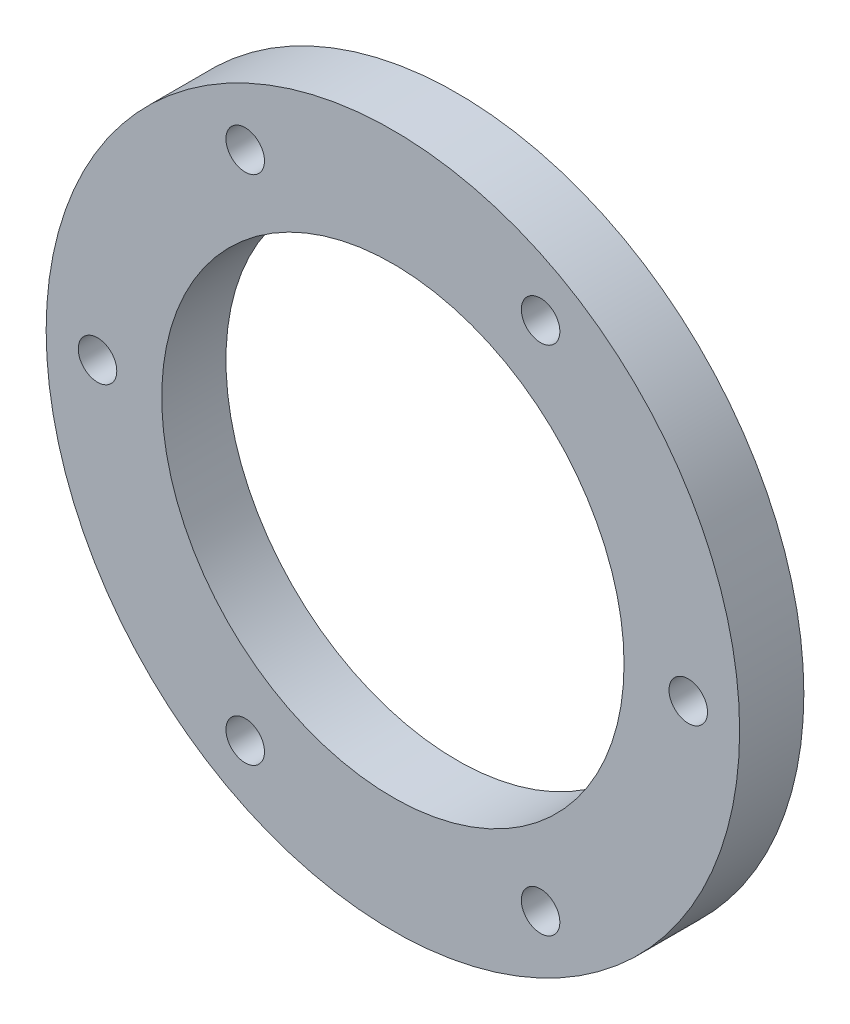
ISO-10303-21;
HEADER;
FILE_DESCRIPTION(('STEP AP214'),'2;1');
FILE_NAME('part.step','',(''),(''),'','','');
FILE_SCHEMA(('AUTOMOTIVE_DESIGN { 1 0 10303 214 1 1 1 1 }'));
ENDSEC;
DATA;
#1=APPLICATION_CONTEXT('core data for automotive mechanical design processes');
#2=APPLICATION_PROTOCOL_DEFINITION('international standard','automotive_design',2000,#1);
#3=PRODUCT_CONTEXT('',#1,'mechanical');
#4=PRODUCT('Part','Part','',(#3));
#5=PRODUCT_RELATED_PRODUCT_CATEGORY('part','',(#4));
#6=PRODUCT_DEFINITION_FORMATION('','',#4);
#7=PRODUCT_DEFINITION_CONTEXT('part definition',#1,'design');
#8=PRODUCT_DEFINITION('design','',#6,#7);
#9=PRODUCT_DEFINITION_SHAPE('','',#8);
#10=(LENGTH_UNIT() NAMED_UNIT(*) SI_UNIT(.MILLI.,.METRE.));
#11=(NAMED_UNIT(*) PLANE_ANGLE_UNIT() SI_UNIT($,.RADIAN.));
#12=(NAMED_UNIT(*) SI_UNIT($,.STERADIAN.) SOLID_ANGLE_UNIT());
#13=UNCERTAINTY_MEASURE_WITH_UNIT(LENGTH_MEASURE(1.E-05),#10,'distance_accuracy_value','');
#14=(GEOMETRIC_REPRESENTATION_CONTEXT(3) GLOBAL_UNCERTAINTY_ASSIGNED_CONTEXT((#13)) GLOBAL_UNIT_ASSIGNED_CONTEXT((#10,
#11,#12)) REPRESENTATION_CONTEXT('',''));
#15=CARTESIAN_POINT('',(0.,0.,0.));
#16=DIRECTION('',(0.,0.,1.));
#17=DIRECTION('',(1.,0.,0.));
#18=AXIS2_PLACEMENT_3D('',#15,#16,#17);
#19=CARTESIAN_POINT('',(0.,0.,5.));
#20=DIRECTION('',(0.,0.,1.));
#21=DIRECTION('',(1.,0.,0.));
#22=AXIS2_PLACEMENT_3D('',#19,#20,#21);
#23=PLANE('',#22);
#24=CARTESIAN_POINT('',(23.,0.,5.));
#25=DIRECTION('',(0.,0.,1.));
#26=DIRECTION('',(1.,0.,0.));
#27=AXIS2_PLACEMENT_3D('',#24,#25,#26);
#28=CIRCLE('',#27,1.5);
#29=CARTESIAN_POINT('',(24.5,0.,5.));
#30=VERTEX_POINT('',#29);
#31=EDGE_CURVE('E71',#30,#30,#28,.T.);
#32=ORIENTED_EDGE('',*,*,#31,.F.);
#33=EDGE_LOOP('',(#32));
#34=FACE_BOUND('',#33,.T.);
#35=CARTESIAN_POINT('',(-11.4999999999999,-19.9185842870421,5.));
#36=DIRECTION('',(0.,0.,1.));
#37=DIRECTION('',(1.,0.,0.));
#38=AXIS2_PLACEMENT_3D('',#35,#36,#37);
#39=CIRCLE('',#38,1.5);
#40=CARTESIAN_POINT('',(-9.99999999999994,-19.9185842870421,5.));
#41=VERTEX_POINT('',#40);
#42=EDGE_CURVE('E59',#41,#41,#39,.T.);
#43=ORIENTED_EDGE('',*,*,#42,.F.);
#44=EDGE_LOOP('',(#43));
#45=FACE_BOUND('',#44,.T.);
#46=CARTESIAN_POINT('',(-11.5000000000001,19.918584287042,5.));
#47=DIRECTION('',(0.,0.,1.));
#48=DIRECTION('',(1.,0.,0.));
#49=AXIS2_PLACEMENT_3D('',#46,#47,#48);
#50=CIRCLE('',#49,1.50000000000001);
#51=CARTESIAN_POINT('',(-10.0000000000001,19.918584287042,5.));
#52=VERTEX_POINT('',#51);
#53=EDGE_CURVE('E47',#52,#52,#50,.T.);
#54=ORIENTED_EDGE('',*,*,#53,.F.);
#55=EDGE_LOOP('',(#54));
#56=FACE_BOUND('',#55,.T.);
#57=CARTESIAN_POINT('',(0.,0.,5.));
#58=DIRECTION('',(0.,0.,1.));
#59=DIRECTION('',(1.,0.,0.));
#60=AXIS2_PLACEMENT_3D('',#57,#58,#59);
#61=CIRCLE('',#60,27.);
#62=CARTESIAN_POINT('',(27.,0.,5.));
#63=VERTEX_POINT('',#62);
#64=EDGE_CURVE('E10',#63,#63,#61,.T.);
#65=ORIENTED_EDGE('',*,*,#64,.T.);
#66=EDGE_LOOP('',(#65));
#67=FACE_BOUND('',#66,.T.);
#68=CARTESIAN_POINT('',(0.,0.,5.));
#69=DIRECTION('',(0.,0.,1.));
#70=DIRECTION('',(1.,0.,0.));
#71=AXIS2_PLACEMENT_3D('',#68,#69,#70);
#72=CIRCLE('',#71,18.);
#73=CARTESIAN_POINT('',(18.,0.,5.));
#74=VERTEX_POINT('',#73);
#75=EDGE_CURVE('E42',#74,#74,#72,.T.);
#76=ORIENTED_EDGE('',*,*,#75,.F.);
#77=EDGE_LOOP('',(#76));
#78=FACE_BOUND('',#77,.T.);
#79=CARTESIAN_POINT('',(-23.,0.,5.));
#80=DIRECTION('',(0.,0.,1.));
#81=DIRECTION('',(1.,0.,0.));
#82=AXIS2_PLACEMENT_3D('',#79,#80,#81);
#83=CIRCLE('',#82,1.5);
#84=CARTESIAN_POINT('',(-21.5,0.,5.));
#85=VERTEX_POINT('',#84);
#86=EDGE_CURVE('E53',#85,#85,#83,.T.);
#87=ORIENTED_EDGE('',*,*,#86,.F.);
#88=EDGE_LOOP('',(#87));
#89=FACE_BOUND('',#88,.T.);
#90=CARTESIAN_POINT('',(11.5000000000001,-19.918584287042,5.));
#91=DIRECTION('',(0.,0.,1.));
#92=DIRECTION('',(1.,0.,0.));
#93=AXIS2_PLACEMENT_3D('',#90,#91,#92);
#94=CIRCLE('',#93,1.5);
#95=CARTESIAN_POINT('',(13.0000000000001,-19.918584287042,5.));
#96=VERTEX_POINT('',#95);
#97=EDGE_CURVE('E65',#96,#96,#94,.T.);
#98=ORIENTED_EDGE('',*,*,#97,.F.);
#99=EDGE_LOOP('',(#98));
#100=FACE_BOUND('',#99,.T.);
#101=CARTESIAN_POINT('',(11.5,19.9185842870421,5.));
#102=DIRECTION('',(0.,0.,1.));
#103=DIRECTION('',(1.,0.,0.));
#104=AXIS2_PLACEMENT_3D('',#101,#102,#103);
#105=CIRCLE('',#104,1.5);
#106=CARTESIAN_POINT('',(12.9999999999999,19.9185842870421,5.));
#107=VERTEX_POINT('',#106);
#108=EDGE_CURVE('E77',#107,#107,#105,.T.);
#109=ORIENTED_EDGE('',*,*,#108,.F.);
#110=EDGE_LOOP('',(#109));
#111=FACE_BOUND('',#110,.T.);
#112=ADVANCED_FACE('F31',(#34,#45,#56,#67,#78,#89,#100,#111),#23,.T.);
#113=CARTESIAN_POINT('',(0.,0.,0.));
#114=DIRECTION('',(0.,0.,1.));
#115=DIRECTION('',(1.,0.,0.));
#116=AXIS2_PLACEMENT_3D('',#113,#114,#115);
#117=PLANE('',#116);
#118=CARTESIAN_POINT('',(0.,0.,0.));
#119=DIRECTION('',(0.,0.,1.));
#120=DIRECTION('',(1.,0.,0.));
#121=AXIS2_PLACEMENT_3D('',#118,#119,#120);
#122=CIRCLE('',#121,27.);
#123=CARTESIAN_POINT('',(27.,0.,0.));
#124=VERTEX_POINT('',#123);
#125=EDGE_CURVE('E35',#124,#124,#122,.T.);
#126=ORIENTED_EDGE('',*,*,#125,.F.);
#127=EDGE_LOOP('',(#126));
#128=FACE_BOUND('',#127,.T.);
#129=CARTESIAN_POINT('',(0.,0.,0.));
#130=DIRECTION('',(0.,0.,1.));
#131=DIRECTION('',(1.,0.,0.));
#132=AXIS2_PLACEMENT_3D('',#129,#130,#131);
#133=CIRCLE('',#132,18.);
#134=CARTESIAN_POINT('',(18.,0.,0.));
#135=VERTEX_POINT('',#134);
#136=EDGE_CURVE('E44',#135,#135,#133,.T.);
#137=ORIENTED_EDGE('',*,*,#136,.T.);
#138=EDGE_LOOP('',(#137));
#139=FACE_BOUND('',#138,.T.);
#140=CARTESIAN_POINT('',(-11.5000000000001,19.918584287042,0.));
#141=DIRECTION('',(0.,0.,1.));
#142=DIRECTION('',(1.,0.,0.));
#143=AXIS2_PLACEMENT_3D('',#140,#141,#142);
#144=CIRCLE('',#143,1.50000000000001);
#145=CARTESIAN_POINT('',(-10.0000000000001,19.918584287042,0.));
#146=VERTEX_POINT('',#145);
#147=EDGE_CURVE('E50',#146,#146,#144,.T.);
#148=ORIENTED_EDGE('',*,*,#147,.T.);
#149=EDGE_LOOP('',(#148));
#150=FACE_BOUND('',#149,.T.);
#151=CARTESIAN_POINT('',(-23.,0.,0.));
#152=DIRECTION('',(0.,0.,1.));
#153=DIRECTION('',(1.,0.,0.));
#154=AXIS2_PLACEMENT_3D('',#151,#152,#153);
#155=CIRCLE('',#154,1.5);
#156=CARTESIAN_POINT('',(-21.5,0.,0.));
#157=VERTEX_POINT('',#156);
#158=EDGE_CURVE('E56',#157,#157,#155,.T.);
#159=ORIENTED_EDGE('',*,*,#158,.T.);
#160=EDGE_LOOP('',(#159));
#161=FACE_BOUND('',#160,.T.);
#162=CARTESIAN_POINT('',(-11.4999999999999,-19.9185842870421,0.));
#163=DIRECTION('',(0.,0.,1.));
#164=DIRECTION('',(1.,0.,0.));
#165=AXIS2_PLACEMENT_3D('',#162,#163,#164);
#166=CIRCLE('',#165,1.5);
#167=CARTESIAN_POINT('',(-9.99999999999994,-19.9185842870421,0.));
#168=VERTEX_POINT('',#167);
#169=EDGE_CURVE('E62',#168,#168,#166,.T.);
#170=ORIENTED_EDGE('',*,*,#169,.T.);
#171=EDGE_LOOP('',(#170));
#172=FACE_BOUND('',#171,.T.);
#173=CARTESIAN_POINT('',(11.5000000000001,-19.918584287042,0.));
#174=DIRECTION('',(0.,0.,1.));
#175=DIRECTION('',(1.,0.,0.));
#176=AXIS2_PLACEMENT_3D('',#173,#174,#175);
#177=CIRCLE('',#176,1.5);
#178=CARTESIAN_POINT('',(13.0000000000001,-19.918584287042,0.));
#179=VERTEX_POINT('',#178);
#180=EDGE_CURVE('E68',#179,#179,#177,.T.);
#181=ORIENTED_EDGE('',*,*,#180,.T.);
#182=EDGE_LOOP('',(#181));
#183=FACE_BOUND('',#182,.T.);
#184=CARTESIAN_POINT('',(23.,0.,0.));
#185=DIRECTION('',(0.,0.,1.));
#186=DIRECTION('',(1.,0.,0.));
#187=AXIS2_PLACEMENT_3D('',#184,#185,#186);
#188=CIRCLE('',#187,1.5);
#189=CARTESIAN_POINT('',(24.5,0.,0.));
#190=VERTEX_POINT('',#189);
#191=EDGE_CURVE('E74',#190,#190,#188,.T.);
#192=ORIENTED_EDGE('',*,*,#191,.T.);
#193=EDGE_LOOP('',(#192));
#194=FACE_BOUND('',#193,.T.);
#195=CARTESIAN_POINT('',(11.5,19.9185842870421,0.));
#196=DIRECTION('',(0.,0.,1.));
#197=DIRECTION('',(1.,0.,0.));
#198=AXIS2_PLACEMENT_3D('',#195,#196,#197);
#199=CIRCLE('',#198,1.5);
#200=CARTESIAN_POINT('',(12.9999999999999,19.9185842870421,0.));
#201=VERTEX_POINT('',#200);
#202=EDGE_CURVE('E80',#201,#201,#199,.T.);
#203=ORIENTED_EDGE('',*,*,#202,.T.);
#204=EDGE_LOOP('',(#203));
#205=FACE_BOUND('',#204,.T.);
#206=ADVANCED_FACE('F90',(#128,#139,#150,#161,#172,#183,#194,#205),#117,.F.);
#207=CARTESIAN_POINT('',(0.,0.,5.));
#208=DIRECTION('',(0.,0.,-1.));
#209=DIRECTION('',(-1.,0.,0.));
#210=AXIS2_PLACEMENT_3D('',#207,#208,#209);
#211=CYLINDRICAL_SURFACE('',#210,27.);
#212=ORIENTED_EDGE('',*,*,#64,.F.);
#213=EDGE_LOOP('',(#212));
#214=FACE_BOUND('',#213,.T.);
#215=ORIENTED_EDGE('',*,*,#125,.T.);
#216=EDGE_LOOP('',(#215));
#217=FACE_BOUND('',#216,.T.);
#218=ADVANCED_FACE('F33',(#214,#217),#211,.T.);
#219=CARTESIAN_POINT('',(0.,0.,5.));
#220=DIRECTION('',(0.,0.,-1.));
#221=DIRECTION('',(-1.,0.,0.));
#222=AXIS2_PLACEMENT_3D('',#219,#220,#221);
#223=CYLINDRICAL_SURFACE('',#222,18.);
#224=ORIENTED_EDGE('',*,*,#75,.T.);
#225=EDGE_LOOP('',(#224));
#226=FACE_BOUND('',#225,.T.);
#227=ORIENTED_EDGE('',*,*,#136,.F.);
#228=EDGE_LOOP('',(#227));
#229=FACE_BOUND('',#228,.T.);
#230=ADVANCED_FACE('F100',(#226,#229),#223,.F.);
#231=CARTESIAN_POINT('',(-11.5000000000001,19.918584287042,5.));
#232=DIRECTION('',(0.,0.,-1.));
#233=DIRECTION('',(-1.,0.,0.));
#234=AXIS2_PLACEMENT_3D('',#231,#232,#233);
#235=CYLINDRICAL_SURFACE('',#234,1.50000000000001);
#236=ORIENTED_EDGE('',*,*,#53,.T.);
#237=EDGE_LOOP('',(#236));
#238=FACE_BOUND('',#237,.T.);
#239=ORIENTED_EDGE('',*,*,#147,.F.);
#240=EDGE_LOOP('',(#239));
#241=FACE_BOUND('',#240,.T.);
#242=ADVANCED_FACE('F103',(#238,#241),#235,.F.);
#243=CARTESIAN_POINT('',(-23.,0.,5.));
#244=DIRECTION('',(0.,0.,-1.));
#245=DIRECTION('',(-1.,0.,0.));
#246=AXIS2_PLACEMENT_3D('',#243,#244,#245);
#247=CYLINDRICAL_SURFACE('',#246,1.5);
#248=ORIENTED_EDGE('',*,*,#86,.T.);
#249=EDGE_LOOP('',(#248));
#250=FACE_BOUND('',#249,.T.);
#251=ORIENTED_EDGE('',*,*,#158,.F.);
#252=EDGE_LOOP('',(#251));
#253=FACE_BOUND('',#252,.T.);
#254=ADVANCED_FACE('F107',(#250,#253),#247,.F.);
#255=CARTESIAN_POINT('',(-11.4999999999999,-19.9185842870421,5.));
#256=DIRECTION('',(0.,0.,-1.));
#257=DIRECTION('',(-1.,0.,0.));
#258=AXIS2_PLACEMENT_3D('',#255,#256,#257);
#259=CYLINDRICAL_SURFACE('',#258,1.5);
#260=ORIENTED_EDGE('',*,*,#42,.T.);
#261=EDGE_LOOP('',(#260));
#262=FACE_BOUND('',#261,.T.);
#263=ORIENTED_EDGE('',*,*,#169,.F.);
#264=EDGE_LOOP('',(#263));
#265=FACE_BOUND('',#264,.T.);
#266=ADVANCED_FACE('F111',(#262,#265),#259,.F.);
#267=CARTESIAN_POINT('',(11.5000000000001,-19.918584287042,5.));
#268=DIRECTION('',(0.,0.,-1.));
#269=DIRECTION('',(-1.,0.,0.));
#270=AXIS2_PLACEMENT_3D('',#267,#268,#269);
#271=CYLINDRICAL_SURFACE('',#270,1.5);
#272=ORIENTED_EDGE('',*,*,#97,.T.);
#273=EDGE_LOOP('',(#272));
#274=FACE_BOUND('',#273,.T.);
#275=ORIENTED_EDGE('',*,*,#180,.F.);
#276=EDGE_LOOP('',(#275));
#277=FACE_BOUND('',#276,.T.);
#278=ADVANCED_FACE('F115',(#274,#277),#271,.F.);
#279=CARTESIAN_POINT('',(23.,0.,5.));
#280=DIRECTION('',(0.,0.,-1.));
#281=DIRECTION('',(-1.,0.,0.));
#282=AXIS2_PLACEMENT_3D('',#279,#280,#281);
#283=CYLINDRICAL_SURFACE('',#282,1.5);
#284=ORIENTED_EDGE('',*,*,#31,.T.);
#285=EDGE_LOOP('',(#284));
#286=FACE_BOUND('',#285,.T.);
#287=ORIENTED_EDGE('',*,*,#191,.F.);
#288=EDGE_LOOP('',(#287));
#289=FACE_BOUND('',#288,.T.);
#290=ADVANCED_FACE('F119',(#286,#289),#283,.F.);
#291=CARTESIAN_POINT('',(11.5,19.9185842870421,5.));
#292=DIRECTION('',(0.,0.,-1.));
#293=DIRECTION('',(-1.,0.,0.));
#294=AXIS2_PLACEMENT_3D('',#291,#292,#293);
#295=CYLINDRICAL_SURFACE('',#294,1.5);
#296=ORIENTED_EDGE('',*,*,#108,.T.);
#297=EDGE_LOOP('',(#296));
#298=FACE_BOUND('',#297,.T.);
#299=ORIENTED_EDGE('',*,*,#202,.F.);
#300=EDGE_LOOP('',(#299));
#301=FACE_BOUND('',#300,.T.);
#302=ADVANCED_FACE('F86',(#298,#301),#295,.F.);
#303=CLOSED_SHELL('',(#112,#206,#218,#230,#242,#254,#266,#278,#290,#302));
#304=MANIFOLD_SOLID_BREP('B2',#303);
#305=ADVANCED_BREP_SHAPE_REPRESENTATION('',(#18,#304),#14);
#306=SHAPE_DEFINITION_REPRESENTATION(#9,#305);
ENDSEC;
END-ISO-10303-21;
